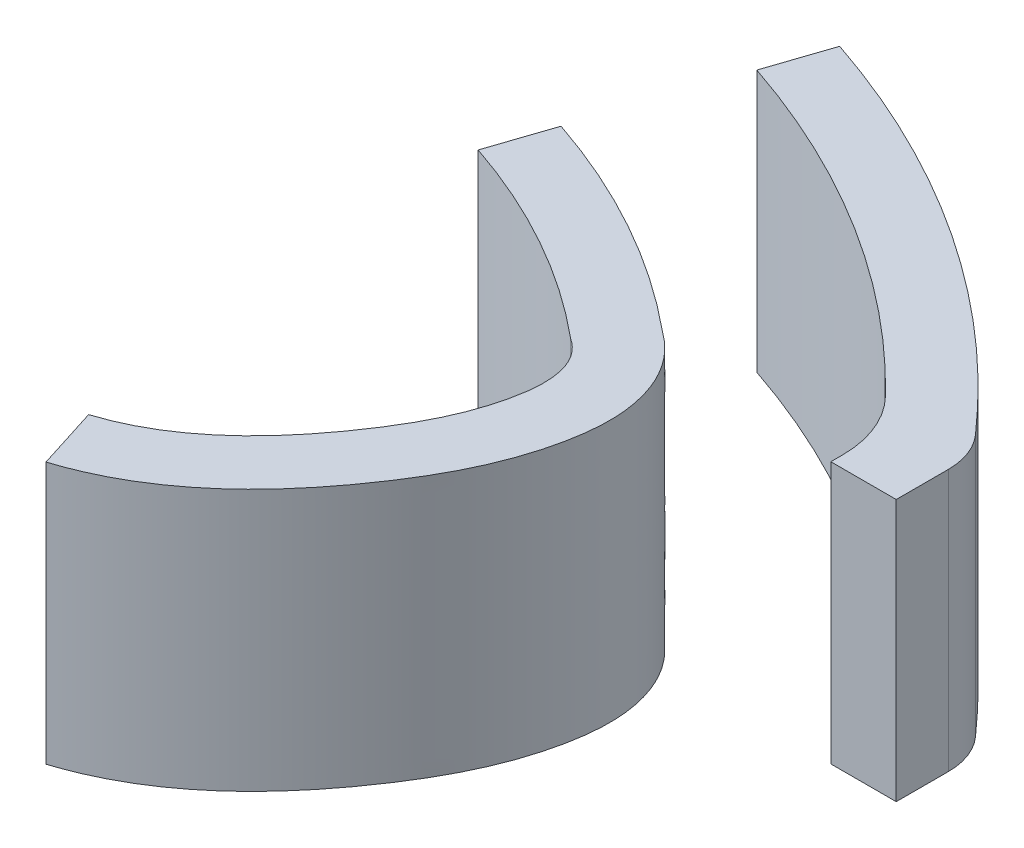
ISO-10303-21;
HEADER;
FILE_DESCRIPTION(('STEP AP214'),'2;1');
FILE_NAME('part.step','',(''),(''),'','','');
FILE_SCHEMA(('AUTOMOTIVE_DESIGN { 1 0 10303 214 1 1 1 1 }'));
ENDSEC;
DATA;
#1=APPLICATION_CONTEXT('core data for automotive mechanical design processes');
#2=APPLICATION_PROTOCOL_DEFINITION('international standard','automotive_design',2000,#1);
#3=PRODUCT_CONTEXT('',#1,'mechanical');
#4=PRODUCT('Part','Part','',(#3));
#5=PRODUCT_RELATED_PRODUCT_CATEGORY('part','',(#4));
#6=PRODUCT_DEFINITION_FORMATION('','',#4);
#7=PRODUCT_DEFINITION_CONTEXT('part definition',#1,'design');
#8=PRODUCT_DEFINITION('design','',#6,#7);
#9=PRODUCT_DEFINITION_SHAPE('','',#8);
#10=(LENGTH_UNIT() NAMED_UNIT(*) SI_UNIT(.MILLI.,.METRE.));
#11=(NAMED_UNIT(*) PLANE_ANGLE_UNIT() SI_UNIT($,.RADIAN.));
#12=(NAMED_UNIT(*) SI_UNIT($,.STERADIAN.) SOLID_ANGLE_UNIT());
#13=UNCERTAINTY_MEASURE_WITH_UNIT(LENGTH_MEASURE(1.E-05),#10,'distance_accuracy_value','');
#14=(GEOMETRIC_REPRESENTATION_CONTEXT(3) GLOBAL_UNCERTAINTY_ASSIGNED_CONTEXT((#13)) GLOBAL_UNIT_ASSIGNED_CONTEXT((#10,
#11,#12)) REPRESENTATION_CONTEXT('',''));
#15=CARTESIAN_POINT('',(0.,0.,0.));
#16=DIRECTION('',(0.,0.,1.));
#17=DIRECTION('',(1.,0.,0.));
#18=AXIS2_PLACEMENT_3D('',#15,#16,#17);
#19=CARTESIAN_POINT('',(0.,86.1131298432801,0.));
#20=DIRECTION('',(0.,-1.,0.));
#21=DIRECTION('',(0.,0.,-1.));
#22=AXIS2_PLACEMENT_3D('',#19,#20,#21);
#23=CYLINDRICAL_SURFACE('',#22,63.315);
#24=CARTESIAN_POINT('',(0.,25.4,0.));
#25=DIRECTION('',(0.,-1.,0.));
#26=DIRECTION('',(0.,0.,-1.));
#27=AXIS2_PLACEMENT_3D('',#24,#25,#26);
#28=CIRCLE('',#27,63.315);
#29=CARTESIAN_POINT('',(20.1844349964252,25.4,-60.0114806422495));
#30=VERTEX_POINT('',#29);
#31=CARTESIAN_POINT('',(40.5241583165948,25.4,-48.6475263269528));
#32=VERTEX_POINT('',#31);
#33=EDGE_CURVE('E53',#30,#32,#28,.T.);
#34=ORIENTED_EDGE('',*,*,#33,.F.);
#35=DIRECTION('',(0.,-1.,0.));
#36=VECTOR('',#35,1.);
#37=CARTESIAN_POINT('',(20.1844349964252,86.1131298432801,-60.0114806422495));
#38=LINE('',#37,#36);
#39=CARTESIAN_POINT('',(20.1844349964252,0.,-60.0114806422495));
#40=VERTEX_POINT('',#39);
#41=EDGE_CURVE('E92',#30,#40,#38,.T.);
#42=ORIENTED_EDGE('',*,*,#41,.T.);
#43=CARTESIAN_POINT('',(0.,0.,0.));
#44=DIRECTION('',(0.,1.,0.));
#45=DIRECTION('',(0.,0.,-1.));
#46=AXIS2_PLACEMENT_3D('',#43,#44,#45);
#47=CIRCLE('',#46,63.315);
#48=CARTESIAN_POINT('',(40.5241583165948,0.,-48.6475263269528));
#49=VERTEX_POINT('',#48);
#50=EDGE_CURVE('E96',#49,#40,#47,.T.);
#51=ORIENTED_EDGE('',*,*,#50,.F.);
#52=DIRECTION('',(0.,-1.,0.));
#53=VECTOR('',#52,1.);
#54=CARTESIAN_POINT('',(40.5241583165948,86.1131298432801,-48.6475263269528));
#55=LINE('',#54,#53);
#56=EDGE_CURVE('E136',#32,#49,#55,.T.);
#57=ORIENTED_EDGE('',*,*,#56,.F.);
#58=EDGE_LOOP('',(#34,#42,#51,#57));
#59=FACE_BOUND('',#58,.T.);
#60=ADVANCED_FACE('F45',(#59),#23,.F.);
#61=CARTESIAN_POINT('',(23.5250140753216,86.1131298432801,-18.8666578366821));
#62=CARTESIAN_POINT('',(26.1145753372756,86.1131298432801,-19.6872356264059));
#63=CARTESIAN_POINT('',(31.7753945834762,86.1131298432801,-22.8535869158645));
#64=CARTESIAN_POINT('',(38.3178524561188,86.1131298432801,-30.6375890655722));
#65=CARTESIAN_POINT('',(43.1425440673904,86.1131298432801,-39.6128528680677));
#66=CARTESIAN_POINT('',(43.312489198036,86.1131298432801,-46.804499087488));
#67=CARTESIAN_POINT('',(40.5241583165948,86.1131298432801,-48.6475263269528));
#68=B_SPLINE_CURVE_WITH_KNOTS('',3,(#61,#62,#63,#64,#65,#66,#67),.UNSPECIFIED.,.F.,.F.,(4,1,1,1,
4),(0.,0.205148784396933,0.5015860380386,0.771461062915226,1.),.UNSPECIFIED.);
#69=DIRECTION('',(0.,-1.,0.));
#70=VECTOR('',#69,1.);
#71=SURFACE_OF_LINEAR_EXTRUSION('',#68,#70);
#72=CARTESIAN_POINT('',(23.5250140753216,25.4,-18.8666578366821));
#73=CARTESIAN_POINT('',(26.1145753372756,25.4,-19.6872356264059));
#74=CARTESIAN_POINT('',(31.7753945834762,25.4,-22.8535869158645));
#75=CARTESIAN_POINT('',(38.3178524561188,25.4,-30.6375890655722));
#76=CARTESIAN_POINT('',(43.1425440673904,25.4,-39.6128528680677));
#77=CARTESIAN_POINT('',(43.312489198036,25.4,-46.804499087488));
#78=CARTESIAN_POINT('',(40.5241583165948,25.4,-48.6475263269528));
#79=B_SPLINE_CURVE_WITH_KNOTS('',3,(#72,#73,#74,#75,#76,#77,#78),.UNSPECIFIED.,.F.,.F.,(4,1,1,1,
4),(0.,0.205148784396933,0.5015860380386,0.771461062915226,1.),.UNSPECIFIED.);
#80=CARTESIAN_POINT('',(23.5250140753216,25.4,-18.8666578366821));
#81=VERTEX_POINT('',#80);
#82=EDGE_CURVE('E161',#32,#81,#79,.F.);
#83=ORIENTED_EDGE('',*,*,#82,.F.);
#84=ORIENTED_EDGE('',*,*,#56,.T.);
#85=CARTESIAN_POINT('',(23.5250140753216,0.,-18.8666578366821));
#86=CARTESIAN_POINT('',(26.1145753372756,0.,-19.6872356264059));
#87=CARTESIAN_POINT('',(31.7753945834762,0.,-22.8535869158645));
#88=CARTESIAN_POINT('',(38.3178524561188,0.,-30.6375890655722));
#89=CARTESIAN_POINT('',(43.1425440673904,0.,-39.6128528680677));
#90=CARTESIAN_POINT('',(43.312489198036,0.,-46.804499087488));
#91=CARTESIAN_POINT('',(40.5241583165948,0.,-48.6475263269528));
#92=B_SPLINE_CURVE_WITH_KNOTS('',3,(#85,#86,#87,#88,#89,#90,#91),.UNSPECIFIED.,.F.,.F.,(4,1,1,1,
4),(0.,0.205148784396933,0.5015860380386,0.771461062915226,1.),.UNSPECIFIED.);
#93=CARTESIAN_POINT('',(23.5250140753216,0.,-18.8666578366821));
#94=VERTEX_POINT('',#93);
#95=EDGE_CURVE('E102',#94,#49,#92,.T.);
#96=ORIENTED_EDGE('',*,*,#95,.F.);
#97=DIRECTION('',(0.,-1.,0.));
#98=VECTOR('',#97,1.);
#99=CARTESIAN_POINT('',(23.5250140753216,86.1131298432801,-18.8666578366821));
#100=LINE('',#99,#98);
#101=EDGE_CURVE('E142',#81,#94,#100,.T.);
#102=ORIENTED_EDGE('',*,*,#101,.F.);
#103=EDGE_LOOP('',(#83,#84,#96,#102));
#104=FACE_BOUND('',#103,.T.);
#105=ADVANCED_FACE('F160',(#104),#71,.T.);
#106=CARTESIAN_POINT('',(23.5250140753216,86.1131298432801,-18.8666578366821));
#107=DIRECTION('',(-0.953283929725984,0.,0.302075734421328));
#108=DIRECTION('',(0.302075734421328,0.,0.953283929725985));
#109=AXIS2_PLACEMENT_3D('',#106,#107,#108);
#110=PLANE('',#109);
#111=DIRECTION('',(0.302075734421328,0.,0.953283929725985));
#112=VECTOR('',#111,1.);
#113=CARTESIAN_POINT('',(23.5250140753216,25.4,-18.8666578366821));
#114=LINE('',#113,#112);
#115=CARTESIAN_POINT('',(25.443194988897,25.4,-12.8133048829221));
#116=VERTEX_POINT('',#115);
#117=EDGE_CURVE('E165',#81,#116,#114,.T.);
#118=ORIENTED_EDGE('',*,*,#117,.F.);
#119=ORIENTED_EDGE('',*,*,#101,.T.);
#120=DIRECTION('',(-0.302075734421328,0.,-0.953283929725985));
#121=VECTOR('',#120,1.);
#122=CARTESIAN_POINT('',(23.5250140753216,0.,-18.8666578366821));
#123=LINE('',#122,#121);
#124=CARTESIAN_POINT('',(25.443194988897,0.,-12.8133048829221));
#125=VERTEX_POINT('',#124);
#126=EDGE_CURVE('E128',#125,#94,#123,.T.);
#127=ORIENTED_EDGE('',*,*,#126,.F.);
#128=DIRECTION('',(0.,-1.,0.));
#129=VECTOR('',#128,1.);
#130=CARTESIAN_POINT('',(25.443194988897,86.1131298432801,-12.8133048829221));
#131=LINE('',#130,#129);
#132=EDGE_CURVE('E144',#116,#125,#131,.T.);
#133=ORIENTED_EDGE('',*,*,#132,.F.);
#134=EDGE_LOOP('',(#118,#119,#127,#133));
#135=FACE_BOUND('',#134,.T.);
#136=ADVANCED_FACE('F180',(#135),#110,.T.);
#137=CARTESIAN_POINT('',(44.0257118802803,86.1131298432801,-53.9450476307913));
#138=CARTESIAN_POINT('',(44.8064288393539,86.1131298432801,-53.429009614633));
#139=CARTESIAN_POINT('',(46.2661804800357,86.1131298432801,-52.2004802617601));
#140=CARTESIAN_POINT('',(47.8753541253478,86.1131298432801,-49.9474273491817));
#141=CARTESIAN_POINT('',(48.8382792905927,86.1131298432801,-47.5695661523365));
#142=CARTESIAN_POINT('',(49.4085705600508,86.1131298432801,-44.5402766816674));
#143=CARTESIAN_POINT('',(49.2709728933973,86.1131298432801,-41.8913531140106));
#144=CARTESIAN_POINT('',(48.8698175509124,86.1131298432801,-39.6020522438165));
#145=CARTESIAN_POINT('',(48.3661657397013,86.1131298432801,-37.5218266881272));
#146=CARTESIAN_POINT('',(47.5351282313937,86.1131298432801,-35.0354896629115));
#147=CARTESIAN_POINT('',(46.3003926378287,86.1131298432801,-32.3037712449237));
#148=CARTESIAN_POINT('',(44.898123630356,86.1131298432801,-29.78301653226));
#149=CARTESIAN_POINT('',(43.4132523288808,86.1131298432801,-27.4746077695997));
#150=CARTESIAN_POINT('',(41.834458355075,86.1131298432801,-25.2464928383444));
#151=CARTESIAN_POINT('',(39.5076301669184,86.1131298432801,-22.3122597535953));
#152=CARTESIAN_POINT('',(36.1785186157308,86.1131298432801,-18.835694792449));
#153=CARTESIAN_POINT('',(32.1460206161688,86.1131298432801,-15.8319759932871));
#154=CARTESIAN_POINT('',(28.4734767069694,86.1131298432801,-13.9100369541319));
#155=CARTESIAN_POINT('',(26.459130098972,86.1131298432801,-13.1352327099659));
#156=CARTESIAN_POINT('',(25.443194988897,86.1131298432801,-12.8133048829221));
#157=B_SPLINE_CURVE_WITH_KNOTS('',3,(#137,#138,#139,#140,#141,#142,#143,#144,#145,#146,#147,
#148,#149,#150,#151,#152,#153,#154,#155,#156),.UNSPECIFIED.,.F.,.F.,(4,1,1,1,1,1,1,1,1,1,1,1,1,
1,1,1,1,4),(0.,0.03125,0.0625,0.09375,0.125,0.1875,0.21875,0.25,0.3125,0.375,0.4375,0.5,0.5625,
0.625,0.75,0.875,0.9375,1.),.UNSPECIFIED.);
#158=DIRECTION('',(0.,-1.,0.));
#159=VECTOR('',#158,1.);
#160=SURFACE_OF_LINEAR_EXTRUSION('',#157,#159);
#161=CARTESIAN_POINT('',(44.0257118802803,25.4,-53.9450476307913));
#162=CARTESIAN_POINT('',(44.8064288393539,25.4,-53.429009614633));
#163=CARTESIAN_POINT('',(46.2661804800357,25.4,-52.2004802617601));
#164=CARTESIAN_POINT('',(47.8753541253478,25.4,-49.9474273491817));
#165=CARTESIAN_POINT('',(48.8382792905927,25.4,-47.5695661523365));
#166=CARTESIAN_POINT('',(49.4085705600508,25.4,-44.5402766816674));
#167=CARTESIAN_POINT('',(49.2709728933973,25.4,-41.8913531140106));
#168=CARTESIAN_POINT('',(48.8698175509124,25.4,-39.6020522438165));
#169=CARTESIAN_POINT('',(48.3661657397013,25.4,-37.5218266881272));
#170=CARTESIAN_POINT('',(47.5351282313937,25.4,-35.0354896629115));
#171=CARTESIAN_POINT('',(46.3003926378287,25.4,-32.3037712449237));
#172=CARTESIAN_POINT('',(44.898123630356,25.4,-29.78301653226));
#173=CARTESIAN_POINT('',(43.4132523288808,25.4,-27.4746077695997));
#174=CARTESIAN_POINT('',(41.834458355075,25.4,-25.2464928383444));
#175=CARTESIAN_POINT('',(39.5076301669184,25.4,-22.3122597535953));
#176=CARTESIAN_POINT('',(36.1785186157308,25.4,-18.835694792449));
#177=CARTESIAN_POINT('',(32.1460206161688,25.4,-15.8319759932871));
#178=CARTESIAN_POINT('',(28.4734767069694,25.4,-13.9100369541319));
#179=CARTESIAN_POINT('',(26.459130098972,25.4,-13.1352327099659));
#180=CARTESIAN_POINT('',(25.443194988897,25.4,-12.8133048829221));
#181=B_SPLINE_CURVE_WITH_KNOTS('',3,(#161,#162,#163,#164,#165,#166,#167,#168,#169,#170,#171,
#172,#173,#174,#175,#176,#177,#178,#179,#180),.UNSPECIFIED.,.F.,.F.,(4,1,1,1,1,1,1,1,1,1,1,1,1,
1,1,1,1,4),(0.,0.03125,0.0625,0.09375,0.125,0.1875,0.21875,0.25,0.3125,0.375,0.4375,0.5,0.5625,
0.625,0.75,0.875,0.9375,1.),.UNSPECIFIED.);
#182=CARTESIAN_POINT('',(44.3606264359218,25.4,-53.7154265291879));
#183=VERTEX_POINT('',#182);
#184=EDGE_CURVE('E60',#116,#183,#181,.F.);
#185=ORIENTED_EDGE('',*,*,#184,.F.);
#186=ORIENTED_EDGE('',*,*,#132,.T.);
#187=CARTESIAN_POINT('',(44.0257118802803,0.,-53.9450476307913));
#188=CARTESIAN_POINT('',(44.8064288393539,0.,-53.429009614633));
#189=CARTESIAN_POINT('',(46.2661804800357,0.,-52.2004802617601));
#190=CARTESIAN_POINT('',(47.8753541253478,0.,-49.9474273491817));
#191=CARTESIAN_POINT('',(48.8382792905927,0.,-47.5695661523365));
#192=CARTESIAN_POINT('',(49.4085705600508,0.,-44.5402766816674));
#193=CARTESIAN_POINT('',(49.2709728933973,0.,-41.8913531140106));
#194=CARTESIAN_POINT('',(48.8698175509124,0.,-39.6020522438165));
#195=CARTESIAN_POINT('',(48.3661657397013,0.,-37.5218266881272));
#196=CARTESIAN_POINT('',(47.5351282313937,0.,-35.0354896629115));
#197=CARTESIAN_POINT('',(46.3003926378287,0.,-32.3037712449237));
#198=CARTESIAN_POINT('',(44.898123630356,0.,-29.78301653226));
#199=CARTESIAN_POINT('',(43.4132523288808,0.,-27.4746077695997));
#200=CARTESIAN_POINT('',(41.834458355075,0.,-25.2464928383444));
#201=CARTESIAN_POINT('',(39.5076301669184,0.,-22.3122597535953));
#202=CARTESIAN_POINT('',(36.1785186157308,0.,-18.835694792449));
#203=CARTESIAN_POINT('',(32.1460206161688,0.,-15.8319759932871));
#204=CARTESIAN_POINT('',(28.4734767069694,0.,-13.9100369541319));
#205=CARTESIAN_POINT('',(26.459130098972,0.,-13.1352327099659));
#206=CARTESIAN_POINT('',(25.443194988897,0.,-12.8133048829221));
#207=B_SPLINE_CURVE_WITH_KNOTS('',3,(#187,#188,#189,#190,#191,#192,#193,#194,#195,#196,#197,
#198,#199,#200,#201,#202,#203,#204,#205,#206),.UNSPECIFIED.,.F.,.F.,(4,1,1,1,1,1,1,1,1,1,1,1,1,
1,1,1,1,4),(0.,0.03125,0.0625,0.09375,0.125,0.1875,0.21875,0.25,0.3125,0.375,0.4375,0.5,0.5625,
0.625,0.75,0.875,0.9375,1.),.UNSPECIFIED.);
#208=CARTESIAN_POINT('',(44.3606264359218,0.,-53.7154265291879));
#209=VERTEX_POINT('',#208);
#210=EDGE_CURVE('E123',#209,#125,#207,.T.);
#211=ORIENTED_EDGE('',*,*,#210,.F.);
#212=DIRECTION('',(0.,-1.,0.));
#213=VECTOR('',#212,1.);
#214=CARTESIAN_POINT('',(44.3606264359218,86.1131298432801,-53.7154265291879));
#215=LINE('',#214,#213);
#216=EDGE_CURVE('E146',#183,#209,#215,.T.);
#217=ORIENTED_EDGE('',*,*,#216,.F.);
#218=EDGE_LOOP('',(#185,#186,#211,#217));
#219=FACE_BOUND('',#218,.T.);
#220=ADVANCED_FACE('F153',(#219),#160,.T.);
#221=CARTESIAN_POINT('',(0.,86.1131298432801,0.));
#222=DIRECTION('',(0.,-1.,0.));
#223=DIRECTION('',(0.,0.,-1.));
#224=AXIS2_PLACEMENT_3D('',#221,#222,#223);
#225=CYLINDRICAL_SURFACE('',#224,69.6649999999999);
#226=CARTESIAN_POINT('',(0.,25.4,0.));
#227=DIRECTION('',(0.,-1.,0.));
#228=DIRECTION('',(0.,0.,-1.));
#229=AXIS2_PLACEMENT_3D('',#226,#227,#228);
#230=CIRCLE('',#229,69.6649999999999);
#231=CARTESIAN_POINT('',(22.2087761829892,25.4,-66.0301634516672));
#232=VERTEX_POINT('',#231);
#233=EDGE_CURVE('E141',#183,#232,#230,.F.);
#234=ORIENTED_EDGE('',*,*,#233,.F.);
#235=ORIENTED_EDGE('',*,*,#216,.T.);
#236=CARTESIAN_POINT('',(0.,0.,0.));
#237=DIRECTION('',(0.,-1.,0.));
#238=DIRECTION('',(0.,0.,-1.));
#239=AXIS2_PLACEMENT_3D('',#236,#237,#238);
#240=CIRCLE('',#239,69.6649999999999);
#241=CARTESIAN_POINT('',(22.2087761829892,0.,-66.0301634516672));
#242=VERTEX_POINT('',#241);
#243=EDGE_CURVE('E110',#242,#209,#240,.T.);
#244=ORIENTED_EDGE('',*,*,#243,.F.);
#245=DIRECTION('',(0.,-1.,0.));
#246=VECTOR('',#245,1.);
#247=CARTESIAN_POINT('',(22.2087761829892,86.1131298432801,-66.0301634516672));
#248=LINE('',#247,#246);
#249=EDGE_CURVE('E101',#232,#242,#248,.T.);
#250=ORIENTED_EDGE('',*,*,#249,.F.);
#251=EDGE_LOOP('',(#234,#235,#244,#250));
#252=FACE_BOUND('',#251,.T.);
#253=ADVANCED_FACE('F151',(#252),#225,.T.);
#254=CARTESIAN_POINT('',(22.2087761829892,86.1131298432801,-66.0301634516672));
#255=DIRECTION('',(-0.947824064475232,0.,-0.318793887647883));
#256=DIRECTION('',(-0.318793887647883,0.,0.947824064475232));
#257=AXIS2_PLACEMENT_3D('',#254,#255,#256);
#258=PLANE('',#257);
#259=DIRECTION('',(-0.318793887647883,0.,0.947824064475232));
#260=VECTOR('',#259,1.);
#261=CARTESIAN_POINT('',(22.2087761829892,25.4,-66.0301634516672));
#262=LINE('',#261,#260);
#263=EDGE_CURVE('E12',#232,#30,#262,.T.);
#264=ORIENTED_EDGE('',*,*,#263,.F.);
#265=ORIENTED_EDGE('',*,*,#249,.T.);
#266=DIRECTION('',(0.318793887647883,0.,-0.947824064475232));
#267=VECTOR('',#266,1.);
#268=CARTESIAN_POINT('',(22.2087761829892,0.,-66.0301634516672));
#269=LINE('',#268,#267);
#270=EDGE_CURVE('E104',#40,#242,#269,.T.);
#271=ORIENTED_EDGE('',*,*,#270,.F.);
#272=ORIENTED_EDGE('',*,*,#41,.F.);
#273=EDGE_LOOP('',(#264,#265,#271,#272));
#274=FACE_BOUND('',#273,.T.);
#275=ADVANCED_FACE('F105',(#274),#258,.T.);
#276=CARTESIAN_POINT('',(0.,0.,0.));
#277=DIRECTION('',(0.,-1.,0.));
#278=DIRECTION('',(0.,0.,-1.));
#279=AXIS2_PLACEMENT_3D('',#276,#277,#278);
#280=PLANE('',#279);
#281=ORIENTED_EDGE('',*,*,#50,.T.);
#282=ORIENTED_EDGE('',*,*,#270,.T.);
#283=ORIENTED_EDGE('',*,*,#243,.T.);
#284=ORIENTED_EDGE('',*,*,#210,.T.);
#285=ORIENTED_EDGE('',*,*,#126,.T.);
#286=ORIENTED_EDGE('',*,*,#95,.T.);
#287=EDGE_LOOP('',(#281,#282,#283,#284,#285,#286));
#288=FACE_BOUND('',#287,.T.);
#289=ADVANCED_FACE('F112',(#288),#280,.T.);
#290=CARTESIAN_POINT('',(63.498380649943,25.4,-56.0010524886359));
#291=DIRECTION('',(0.,-1.,0.));
#292=DIRECTION('',(0.,0.,-1.));
#293=AXIS2_PLACEMENT_3D('',#290,#291,#292);
#294=PLANE('',#293);
#295=ORIENTED_EDGE('',*,*,#33,.T.);
#296=ORIENTED_EDGE('',*,*,#82,.T.);
#297=ORIENTED_EDGE('',*,*,#117,.T.);
#298=ORIENTED_EDGE('',*,*,#184,.T.);
#299=ORIENTED_EDGE('',*,*,#233,.T.);
#300=ORIENTED_EDGE('',*,*,#263,.T.);
#301=EDGE_LOOP('',(#295,#296,#297,#298,#299,#300));
#302=FACE_BOUND('',#301,.T.);
#303=ADVANCED_FACE('F162',(#302),#294,.F.);
#304=CLOSED_SHELL('',(#60,#105,#136,#220,#253,#275,#289,#303));
#305=MANIFOLD_SOLID_BREP('B2',#304);
#306=CARTESIAN_POINT('',(63.498380649943,25.4,-56.0010524886359));
#307=DIRECTION('',(0.,-1.,0.));
#308=DIRECTION('',(0.,0.,-1.));
#309=AXIS2_PLACEMENT_3D('',#306,#307,#308);
#310=CYLINDRICAL_SURFACE('',#309,6.34999999999998);
#311=CARTESIAN_POINT('',(63.498380649943,0.,-56.0010524886359));
#312=DIRECTION('',(0.,1.,0.));
#313=DIRECTION('',(0.,0.,-1.));
#314=AXIS2_PLACEMENT_3D('',#311,#312,#313);
#315=CIRCLE('',#314,6.34999999999998);
#316=CARTESIAN_POINT('',(69.8483806499429,0.,-56.0010524886359));
#317=VERTEX_POINT('',#316);
#318=CARTESIAN_POINT('',(68.2608529481434,0.,-60.2012141056304));
#319=VERTEX_POINT('',#318);
#320=EDGE_CURVE('E343',#317,#319,#315,.T.);
#321=ORIENTED_EDGE('',*,*,#320,.T.);
#322=DIRECTION('',(0.,-1.,0.));
#323=VECTOR('',#322,1.);
#324=CARTESIAN_POINT('',(68.2608529481434,25.4,-60.2012141056304));
#325=LINE('',#324,#323);
#326=CARTESIAN_POINT('',(68.2608529481434,25.4,-60.2012141056304));
#327=VERTEX_POINT('',#326);
#328=EDGE_CURVE('E324',#327,#319,#325,.T.);
#329=ORIENTED_EDGE('',*,*,#328,.F.);
#330=CARTESIAN_POINT('',(63.498380649943,25.4,-56.0010524886359));
#331=DIRECTION('',(0.,1.,0.));
#332=DIRECTION('',(0.,0.,-1.));
#333=AXIS2_PLACEMENT_3D('',#330,#331,#332);
#334=CIRCLE('',#333,6.34999999999998);
#335=CARTESIAN_POINT('',(69.8483806499429,25.4,-56.0010524886359));
#336=VERTEX_POINT('',#335);
#337=EDGE_CURVE('E331',#336,#327,#334,.T.);
#338=ORIENTED_EDGE('',*,*,#337,.F.);
#339=DIRECTION('',(0.,-1.,0.));
#340=VECTOR('',#339,1.);
#341=CARTESIAN_POINT('',(69.8483806499429,25.4,-56.0010524886359));
#342=LINE('',#341,#340);
#343=EDGE_CURVE('E360',#336,#317,#342,.T.);
#344=ORIENTED_EDGE('',*,*,#343,.T.);
#345=EDGE_LOOP('',(#321,#329,#338,#344));
#346=FACE_BOUND('',#345,.T.);
#347=ADVANCED_FACE('F255',(#346),#310,.T.);
#348=CARTESIAN_POINT('',(0.,25.4,0.));
#349=DIRECTION('',(0.,-1.,0.));
#350=DIRECTION('',(0.,0.,-1.));
#351=AXIS2_PLACEMENT_3D('',#348,#349,#350);
#352=CYLINDRICAL_SURFACE('',#351,91.015);
#353=CARTESIAN_POINT('',(0.,0.,0.));
#354=DIRECTION('',(0.,1.,0.));
#355=DIRECTION('',(0.,0.,1.));
#356=AXIS2_PLACEMENT_3D('',#353,#354,#355);
#357=CIRCLE('',#356,91.015);
#358=CARTESIAN_POINT('',(29.0150256842714,0.,-86.2662072282135));
#359=VERTEX_POINT('',#358);
#360=EDGE_CURVE('E371',#319,#359,#357,.T.);
#361=ORIENTED_EDGE('',*,*,#360,.T.);
#362=DIRECTION('',(0.,-1.,0.));
#363=VECTOR('',#362,1.);
#364=CARTESIAN_POINT('',(29.0150256842714,25.4,-86.2662072282135));
#365=LINE('',#364,#363);
#366=CARTESIAN_POINT('',(29.0150256842714,25.4,-86.2662072282135));
#367=VERTEX_POINT('',#366);
#368=EDGE_CURVE('E327',#367,#359,#365,.T.);
#369=ORIENTED_EDGE('',*,*,#368,.F.);
#370=CARTESIAN_POINT('',(0.,25.4,0.));
#371=DIRECTION('',(0.,1.,0.));
#372=DIRECTION('',(0.,0.,1.));
#373=AXIS2_PLACEMENT_3D('',#370,#371,#372);
#374=CIRCLE('',#373,91.015);
#375=EDGE_CURVE('E320',#327,#367,#374,.T.);
#376=ORIENTED_EDGE('',*,*,#375,.F.);
#377=ORIENTED_EDGE('',*,*,#328,.T.);
#378=EDGE_LOOP('',(#361,#369,#376,#377));
#379=FACE_BOUND('',#378,.T.);
#380=ADVANCED_FACE('F322',(#379),#352,.T.);
#381=CARTESIAN_POINT('',(26.9906844977074,25.4,-80.2475244187958));
#382=DIRECTION('',(0.947824064475235,0.,0.318793887647876));
#383=DIRECTION('',(0.318793887647876,0.,-0.947824064475235));
#384=AXIS2_PLACEMENT_3D('',#381,#382,#383);
#385=PLANE('',#384);
#386=DIRECTION('',(-0.318793887647876,0.,0.947824064475235));
#387=VECTOR('',#386,1.);
#388=CARTESIAN_POINT('',(26.9906844977074,0.,-80.2475244187958));
#389=LINE('',#388,#387);
#390=CARTESIAN_POINT('',(26.9906844977074,0.,-80.2475244187958));
#391=VERTEX_POINT('',#390);
#392=EDGE_CURVE('E369',#359,#391,#389,.T.);
#393=ORIENTED_EDGE('',*,*,#392,.T.);
#394=DIRECTION('',(0.,-1.,0.));
#395=VECTOR('',#394,1.);
#396=CARTESIAN_POINT('',(26.9906844977074,25.4,-80.2475244187958));
#397=LINE('',#396,#395);
#398=CARTESIAN_POINT('',(26.9906844977074,25.4,-80.2475244187958));
#399=VERTEX_POINT('',#398);
#400=EDGE_CURVE('E348',#399,#391,#397,.T.);
#401=ORIENTED_EDGE('',*,*,#400,.F.);
#402=DIRECTION('',(-0.318793887647876,0.,0.947824064475235));
#403=VECTOR('',#402,1.);
#404=CARTESIAN_POINT('',(26.9906844977074,25.4,-80.2475244187958));
#405=LINE('',#404,#403);
#406=EDGE_CURVE('E330',#367,#399,#405,.T.);
#407=ORIENTED_EDGE('',*,*,#406,.F.);
#408=ORIENTED_EDGE('',*,*,#368,.T.);
#409=EDGE_LOOP('',(#393,#401,#407,#408));
#410=FACE_BOUND('',#409,.T.);
#411=ADVANCED_FACE('F384',(#410),#385,.F.);
#412=CARTESIAN_POINT('',(0.,25.4,0.));
#413=DIRECTION('',(0.,-1.,0.));
#414=DIRECTION('',(0.,0.,-1.));
#415=AXIS2_PLACEMENT_3D('',#412,#413,#414);
#416=CYLINDRICAL_SURFACE('',#415,84.665);
#417=CARTESIAN_POINT('',(0.,0.,0.));
#418=DIRECTION('',(0.,-1.,0.));
#419=DIRECTION('',(0.,0.,1.));
#420=AXIS2_PLACEMENT_3D('',#417,#418,#419);
#421=CIRCLE('',#420,84.665);
#422=CARTESIAN_POINT('',(60.6635022798824,0.,-59.0601533704299));
#423=VERTEX_POINT('',#422);
#424=EDGE_CURVE('E367',#391,#423,#421,.T.);
#425=ORIENTED_EDGE('',*,*,#424,.T.);
#426=DIRECTION('',(0.,-1.,0.));
#427=VECTOR('',#426,1.);
#428=CARTESIAN_POINT('',(60.6635022798824,25.4,-59.0601533704299));
#429=LINE('',#428,#427);
#430=CARTESIAN_POINT('',(60.6635022798824,25.4,-59.0601533704299));
#431=VERTEX_POINT('',#430);
#432=EDGE_CURVE('E270',#423,#431,#429,.F.);
#433=ORIENTED_EDGE('',*,*,#432,.T.);
#434=CARTESIAN_POINT('',(0.,25.4,0.));
#435=DIRECTION('',(0.,-1.,0.));
#436=DIRECTION('',(0.,0.,1.));
#437=AXIS2_PLACEMENT_3D('',#434,#435,#436);
#438=CIRCLE('',#437,84.665);
#439=EDGE_CURVE('E379',#399,#431,#438,.T.);
#440=ORIENTED_EDGE('',*,*,#439,.F.);
#441=ORIENTED_EDGE('',*,*,#400,.T.);
#442=EDGE_LOOP('',(#425,#433,#440,#441));
#443=FACE_BOUND('',#442,.T.);
#444=ADVANCED_FACE('F386',(#443),#416,.F.);
#445=CARTESIAN_POINT('',(63.498380649943,25.4,-56.0010524886359));
#446=DIRECTION('',(1.,0.,0.));
#447=DIRECTION('',(0.,0.,-1.));
#448=AXIS2_PLACEMENT_3D('',#445,#446,#447);
#449=PLANE('',#448);
#450=DIRECTION('',(0.,0.,1.));
#451=VECTOR('',#450,1.);
#452=CARTESIAN_POINT('',(63.498380649943,25.4,-56.0010524886359));
#453=LINE('',#452,#451);
#454=CARTESIAN_POINT('',(63.498380649943,25.4,-52.0844073867968));
#455=VERTEX_POINT('',#454);
#456=CARTESIAN_POINT('',(63.498380649943,25.4,-50.9210524886359));
#457=VERTEX_POINT('',#456);
#458=EDGE_CURVE('E377',#455,#457,#453,.T.);
#459=ORIENTED_EDGE('',*,*,#458,.F.);
#460=DIRECTION('',(0.,1.,0.));
#461=VECTOR('',#460,1.);
#462=CARTESIAN_POINT('',(63.498380649943,0.,-52.0844073867968));
#463=LINE('',#462,#461);
#464=CARTESIAN_POINT('',(63.498380649943,0.,-52.0844073867968));
#465=VERTEX_POINT('',#464);
#466=EDGE_CURVE('E344',#455,#465,#463,.F.);
#467=ORIENTED_EDGE('',*,*,#466,.T.);
#468=DIRECTION('',(0.,0.,1.));
#469=VECTOR('',#468,1.);
#470=CARTESIAN_POINT('',(63.498380649943,0.,-56.0010524886359));
#471=LINE('',#470,#469);
#472=CARTESIAN_POINT('',(63.498380649943,0.,-50.9210524886359));
#473=VERTEX_POINT('',#472);
#474=EDGE_CURVE('E365',#465,#473,#471,.T.);
#475=ORIENTED_EDGE('',*,*,#474,.T.);
#476=DIRECTION('',(0.,-1.,0.));
#477=VECTOR('',#476,1.);
#478=CARTESIAN_POINT('',(63.498380649943,25.4,-50.9210524886359));
#479=LINE('',#478,#477);
#480=EDGE_CURVE('E354',#457,#473,#479,.T.);
#481=ORIENTED_EDGE('',*,*,#480,.F.);
#482=EDGE_LOOP('',(#459,#467,#475,#481));
#483=FACE_BOUND('',#482,.T.);
#484=ADVANCED_FACE('F388',(#483),#449,.F.);
#485=CARTESIAN_POINT('',(63.498380649943,25.4,-50.9210524886359));
#486=DIRECTION('',(0.,0.,-1.));
#487=DIRECTION('',(-1.,0.,0.));
#488=AXIS2_PLACEMENT_3D('',#485,#486,#487);
#489=PLANE('',#488);
#490=DIRECTION('',(1.,0.,0.));
#491=VECTOR('',#490,1.);
#492=CARTESIAN_POINT('',(63.498380649943,0.,-50.9210524886359));
#493=LINE('',#492,#491);
#494=CARTESIAN_POINT('',(69.848380649943,0.,-50.9210524886359));
#495=VERTEX_POINT('',#494);
#496=EDGE_CURVE('E363',#473,#495,#493,.T.);
#497=ORIENTED_EDGE('',*,*,#496,.T.);
#498=DIRECTION('',(0.,-1.,0.));
#499=VECTOR('',#498,1.);
#500=CARTESIAN_POINT('',(69.848380649943,25.4,-50.9210524886359));
#501=LINE('',#500,#499);
#502=CARTESIAN_POINT('',(69.848380649943,25.4,-50.9210524886359));
#503=VERTEX_POINT('',#502);
#504=EDGE_CURVE('E357',#503,#495,#501,.T.);
#505=ORIENTED_EDGE('',*,*,#504,.F.);
#506=DIRECTION('',(1.,0.,0.));
#507=VECTOR('',#506,1.);
#508=CARTESIAN_POINT('',(63.498380649943,25.4,-50.9210524886359));
#509=LINE('',#508,#507);
#510=EDGE_CURVE('E375',#457,#503,#509,.T.);
#511=ORIENTED_EDGE('',*,*,#510,.F.);
#512=ORIENTED_EDGE('',*,*,#480,.T.);
#513=EDGE_LOOP('',(#497,#505,#511,#512));
#514=FACE_BOUND('',#513,.T.);
#515=ADVANCED_FACE('F394',(#514),#489,.F.);
#516=CARTESIAN_POINT('',(69.8483806499429,25.4,-56.0010524886359));
#517=DIRECTION('',(-1.,0.,0.));
#518=DIRECTION('',(0.,0.,1.));
#519=AXIS2_PLACEMENT_3D('',#516,#517,#518);
#520=PLANE('',#519);
#521=DIRECTION('',(0.,0.,-1.));
#522=VECTOR('',#521,1.);
#523=CARTESIAN_POINT('',(69.8483806499429,0.,-56.0010524886359));
#524=LINE('',#523,#522);
#525=EDGE_CURVE('E340',#495,#317,#524,.T.);
#526=ORIENTED_EDGE('',*,*,#525,.T.);
#527=ORIENTED_EDGE('',*,*,#343,.F.);
#528=DIRECTION('',(0.,0.,-1.));
#529=VECTOR('',#528,1.);
#530=CARTESIAN_POINT('',(69.8483806499429,25.4,-56.0010524886359));
#531=LINE('',#530,#529);
#532=EDGE_CURVE('E336',#503,#336,#531,.T.);
#533=ORIENTED_EDGE('',*,*,#532,.F.);
#534=ORIENTED_EDGE('',*,*,#504,.T.);
#535=EDGE_LOOP('',(#526,#527,#533,#534));
#536=FACE_BOUND('',#535,.T.);
#537=ADVANCED_FACE('F419',(#536),#520,.F.);
#538=CARTESIAN_POINT('',(63.498380649943,25.4,-56.0010524886359));
#539=DIRECTION('',(0.,-1.,0.));
#540=DIRECTION('',(0.,0.,-1.));
#541=AXIS2_PLACEMENT_3D('',#538,#539,#540);
#542=PLANE('',#541);
#543=ORIENTED_EDGE('',*,*,#337,.T.);
#544=ORIENTED_EDGE('',*,*,#375,.T.);
#545=ORIENTED_EDGE('',*,*,#406,.T.);
#546=ORIENTED_EDGE('',*,*,#439,.T.);
#547=CARTESIAN_POINT('',(53.498380649943,25.4,-52.0844073867968));
#548=DIRECTION('',(0.,-1.,0.));
#549=DIRECTION('',(0.,0.,-1.));
#550=AXIS2_PLACEMENT_3D('',#547,#548,#549);
#551=CIRCLE('',#550,10.);
#552=EDGE_CURVE('E43',#431,#455,#551,.T.);
#553=ORIENTED_EDGE('',*,*,#552,.T.);
#554=ORIENTED_EDGE('',*,*,#458,.T.);
#555=ORIENTED_EDGE('',*,*,#510,.T.);
#556=ORIENTED_EDGE('',*,*,#532,.T.);
#557=EDGE_LOOP('',(#543,#544,#545,#546,#553,#554,#555,#556));
#558=FACE_BOUND('',#557,.T.);
#559=ADVANCED_FACE('F334',(#558),#542,.F.);
#560=CARTESIAN_POINT('',(63.498380649943,0.,-56.0010524886359));
#561=DIRECTION('',(0.,-1.,0.));
#562=DIRECTION('',(0.,0.,-1.));
#563=AXIS2_PLACEMENT_3D('',#560,#561,#562);
#564=PLANE('',#563);
#565=ORIENTED_EDGE('',*,*,#320,.F.);
#566=ORIENTED_EDGE('',*,*,#525,.F.);
#567=ORIENTED_EDGE('',*,*,#496,.F.);
#568=ORIENTED_EDGE('',*,*,#474,.F.);
#569=CARTESIAN_POINT('',(53.498380649943,0.,-52.0844073867968));
#570=DIRECTION('',(0.,-1.,0.));
#571=DIRECTION('',(0.,0.,-1.));
#572=AXIS2_PLACEMENT_3D('',#569,#570,#571);
#573=CIRCLE('',#572,10.);
#574=EDGE_CURVE('E263',#465,#423,#573,.F.);
#575=ORIENTED_EDGE('',*,*,#574,.T.);
#576=ORIENTED_EDGE('',*,*,#424,.F.);
#577=ORIENTED_EDGE('',*,*,#392,.F.);
#578=ORIENTED_EDGE('',*,*,#360,.F.);
#579=EDGE_LOOP('',(#565,#566,#567,#568,#575,#576,#577,#578));
#580=FACE_BOUND('',#579,.T.);
#581=ADVANCED_FACE('F447',(#580),#564,.T.);
#582=CARTESIAN_POINT('',(53.498380649943,25.4,-52.0844073867968));
#583=DIRECTION('',(0.,-1.,0.));
#584=DIRECTION('',(0.,0.,-1.));
#585=AXIS2_PLACEMENT_3D('',#582,#583,#584);
#586=CYLINDRICAL_SURFACE('',#585,10.);
#587=ORIENTED_EDGE('',*,*,#552,.F.);
#588=ORIENTED_EDGE('',*,*,#432,.F.);
#589=ORIENTED_EDGE('',*,*,#574,.F.);
#590=ORIENTED_EDGE('',*,*,#466,.F.);
#591=EDGE_LOOP('',(#587,#588,#589,#590));
#592=FACE_BOUND('',#591,.T.);
#593=ADVANCED_FACE('F257',(#592),#586,.F.);
#594=CLOSED_SHELL('',(#347,#380,#411,#444,#484,#515,#537,#559,#581,#593));
#595=MANIFOLD_SOLID_BREP('B6',#594);
#596=ADVANCED_BREP_SHAPE_REPRESENTATION('',(#18,#305,#595),#14);
#597=SHAPE_DEFINITION_REPRESENTATION(#9,#596);
ENDSEC;
END-ISO-10303-21;
